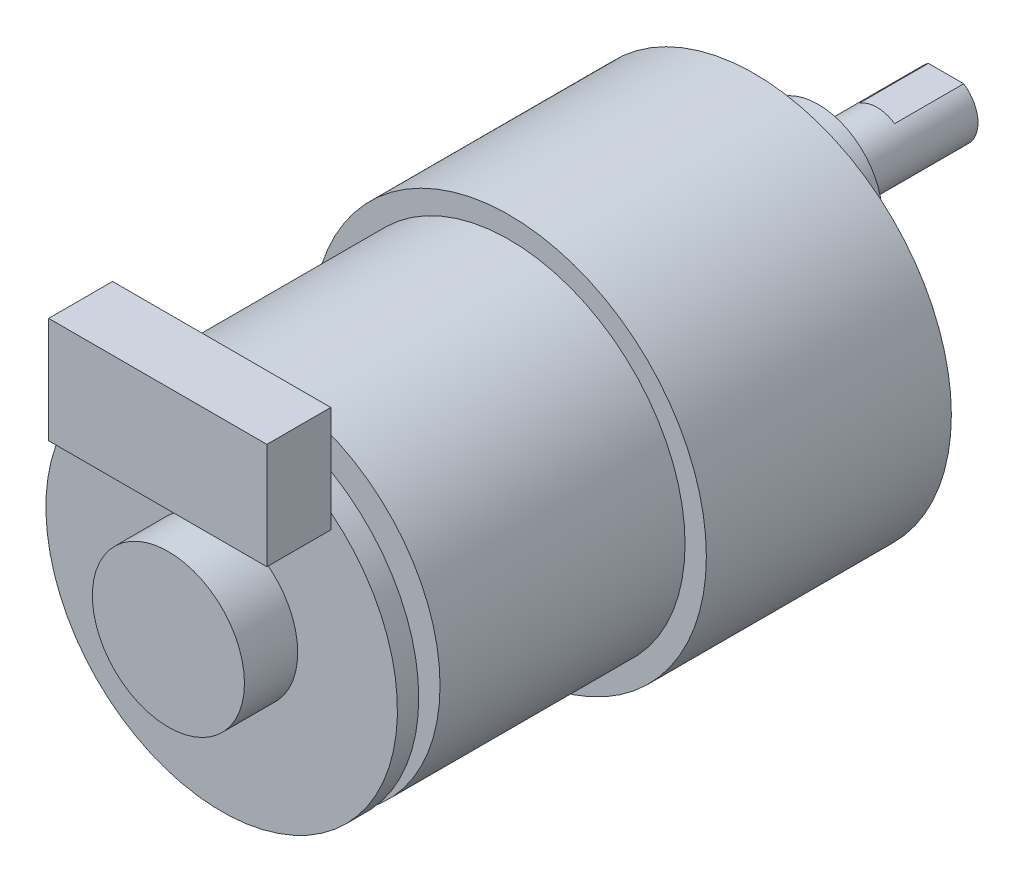
ISO-10303-21;
HEADER;
FILE_DESCRIPTION(('STEP AP214'),'2;1');
FILE_NAME('part.step','',(''),(''),'','','');
FILE_SCHEMA(('AUTOMOTIVE_DESIGN { 1 0 10303 214 1 1 1 1 }'));
ENDSEC;
DATA;
#1=APPLICATION_CONTEXT('core data for automotive mechanical design processes');
#2=APPLICATION_PROTOCOL_DEFINITION('international standard','automotive_design',2000,#1);
#3=PRODUCT_CONTEXT('',#1,'mechanical');
#4=PRODUCT('Part','Part','',(#3));
#5=PRODUCT_RELATED_PRODUCT_CATEGORY('part','',(#4));
#6=PRODUCT_DEFINITION_FORMATION('','',#4);
#7=PRODUCT_DEFINITION_CONTEXT('part definition',#1,'design');
#8=PRODUCT_DEFINITION('design','',#6,#7);
#9=PRODUCT_DEFINITION_SHAPE('','',#8);
#10=(LENGTH_UNIT() NAMED_UNIT(*) SI_UNIT(.MILLI.,.METRE.));
#11=(NAMED_UNIT(*) PLANE_ANGLE_UNIT() SI_UNIT($,.RADIAN.));
#12=(NAMED_UNIT(*) SI_UNIT($,.STERADIAN.) SOLID_ANGLE_UNIT());
#13=UNCERTAINTY_MEASURE_WITH_UNIT(LENGTH_MEASURE(1.E-05),#10,'distance_accuracy_value','');
#14=(GEOMETRIC_REPRESENTATION_CONTEXT(3) GLOBAL_UNCERTAINTY_ASSIGNED_CONTEXT((#13)) GLOBAL_UNIT_ASSIGNED_CONTEXT((#10,
#11,#12)) REPRESENTATION_CONTEXT('',''));
#15=CARTESIAN_POINT('',(0.,0.,0.));
#16=DIRECTION('',(0.,0.,1.));
#17=DIRECTION('',(1.,0.,0.));
#18=AXIS2_PLACEMENT_3D('',#15,#16,#17);
#19=CARTESIAN_POINT('',(0.,0.,50.));
#20=DIRECTION('',(0.,0.,1.));
#21=DIRECTION('',(1.,0.,0.));
#22=AXIS2_PLACEMENT_3D('',#19,#20,#21);
#23=PLANE('',#22);
#24=CARTESIAN_POINT('',(0.,0.,50.));
#25=DIRECTION('',(0.,0.,1.));
#26=DIRECTION('',(1.,0.,0.));
#27=AXIS2_PLACEMENT_3D('',#24,#25,#26);
#28=CIRCLE('',#27,7.13953177742998);
#29=CARTESIAN_POINT('',(7.13953177742998,0.,50.));
#30=VERTEX_POINT('',#29);
#31=EDGE_CURVE('E122',#30,#30,#28,.T.);
#32=ORIENTED_EDGE('',*,*,#31,.F.);
#33=EDGE_LOOP('',(#32));
#34=FACE_BOUND('',#33,.T.);
#35=CARTESIAN_POINT('',(0.,0.,50.));
#36=DIRECTION('',(0.,0.,1.));
#37=DIRECTION('',(1.,0.,0.));
#38=AXIS2_PLACEMENT_3D('',#35,#36,#37);
#39=CIRCLE('',#38,16.5);
#40=CARTESIAN_POINT('',(-10.2436666402565,12.9351186219259,50.));
#41=VERTEX_POINT('',#40);
#42=CARTESIAN_POINT('',(10.2436666402565,12.9351186219259,50.));
#43=VERTEX_POINT('',#42);
#44=EDGE_CURVE('E136',#41,#43,#39,.T.);
#45=ORIENTED_EDGE('',*,*,#44,.T.);
#46=DIRECTION('',(0.,1.,0.));
#47=VECTOR('',#46,1.);
#48=CARTESIAN_POINT('',(10.2436666402565,21.4758750297111,50.));
#49=LINE('',#48,#47);
#50=CARTESIAN_POINT('',(10.2436666402565,11.5241249702889,50.));
#51=VERTEX_POINT('',#50);
#52=EDGE_CURVE('E614',#51,#43,#49,.T.);
#53=ORIENTED_EDGE('',*,*,#52,.F.);
#54=DIRECTION('',(1.,0.,0.));
#55=VECTOR('',#54,1.);
#56=CARTESIAN_POINT('',(-10.2436666402565,11.5241249702889,50.));
#57=LINE('',#56,#55);
#58=CARTESIAN_POINT('',(-10.2436666402565,11.5241249702889,50.));
#59=VERTEX_POINT('',#58);
#60=EDGE_CURVE('E116',#59,#51,#57,.T.);
#61=ORIENTED_EDGE('',*,*,#60,.F.);
#62=DIRECTION('',(0.,1.,0.));
#63=VECTOR('',#62,1.);
#64=CARTESIAN_POINT('',(-10.2436666402565,0.,50.));
#65=LINE('',#64,#63);
#66=EDGE_CURVE('E11',#59,#41,#65,.T.);
#67=ORIENTED_EDGE('',*,*,#66,.T.);
#68=EDGE_LOOP('',(#45,#53,#61,#67));
#69=FACE_BOUND('',#68,.T.);
#70=ADVANCED_FACE('F37',(#34,#69),#23,.T.);
#71=CARTESIAN_POINT('',(0.,0.,23.));
#72=DIRECTION('',(0.,0.,-1.));
#73=DIRECTION('',(-1.,0.,0.));
#74=AXIS2_PLACEMENT_3D('',#71,#72,#73);
#75=CYLINDRICAL_SURFACE('',#74,18.5);
#76=CARTESIAN_POINT('',(0.,0.,23.));
#77=DIRECTION('',(0.,0.,1.));
#78=DIRECTION('',(1.,0.,0.));
#79=AXIS2_PLACEMENT_3D('',#76,#77,#78);
#80=CIRCLE('',#79,18.5);
#81=CARTESIAN_POINT('',(18.5,0.,23.));
#82=VERTEX_POINT('',#81);
#83=EDGE_CURVE('E172',#82,#82,#80,.T.);
#84=ORIENTED_EDGE('',*,*,#83,.F.);
#85=EDGE_LOOP('',(#84));
#86=FACE_BOUND('',#85,.T.);
#87=CARTESIAN_POINT('',(0.,0.,0.));
#88=DIRECTION('',(0.,0.,1.));
#89=DIRECTION('',(1.,0.,0.));
#90=AXIS2_PLACEMENT_3D('',#87,#88,#89);
#91=CIRCLE('',#90,18.5);
#92=CARTESIAN_POINT('',(18.5,0.,0.));
#93=VERTEX_POINT('',#92);
#94=EDGE_CURVE('E169',#93,#93,#91,.T.);
#95=ORIENTED_EDGE('',*,*,#94,.T.);
#96=EDGE_LOOP('',(#95));
#97=FACE_BOUND('',#96,.T.);
#98=ADVANCED_FACE('F39',(#86,#97),#75,.T.);
#99=CARTESIAN_POINT('',(0.,0.,23.));
#100=DIRECTION('',(0.,0.,1.));
#101=DIRECTION('',(1.,0.,0.));
#102=AXIS2_PLACEMENT_3D('',#99,#100,#101);
#103=PLANE('',#102);
#104=CARTESIAN_POINT('',(0.,0.,23.));
#105=DIRECTION('',(0.,0.,1.));
#106=DIRECTION('',(1.,0.,0.));
#107=AXIS2_PLACEMENT_3D('',#104,#105,#106);
#108=CIRCLE('',#107,16.5);
#109=CARTESIAN_POINT('',(16.5,0.,23.));
#110=VERTEX_POINT('',#109);
#111=EDGE_CURVE('E165',#110,#110,#108,.T.);
#112=ORIENTED_EDGE('',*,*,#111,.F.);
#113=EDGE_LOOP('',(#112));
#114=FACE_BOUND('',#113,.T.);
#115=ORIENTED_EDGE('',*,*,#83,.T.);
#116=EDGE_LOOP('',(#115));
#117=FACE_BOUND('',#116,.T.);
#118=ADVANCED_FACE('F207',(#114,#117),#103,.T.);
#119=CARTESIAN_POINT('',(0.,0.,0.));
#120=DIRECTION('',(0.,0.,1.));
#121=DIRECTION('',(1.,0.,0.));
#122=AXIS2_PLACEMENT_3D('',#119,#120,#121);
#123=PLANE('',#122);
#124=CARTESIAN_POINT('',(-7.74999999999997,-13.4233937586588,0.));
#125=DIRECTION('',(0.,0.,-1.));
#126=DIRECTION('',(-1.,0.,0.));
#127=AXIS2_PLACEMENT_3D('',#124,#125,#126);
#128=CIRCLE('',#127,1.5);
#129=CARTESIAN_POINT('',(-9.24999999999997,-13.4233937586588,0.));
#130=VERTEX_POINT('',#129);
#131=EDGE_CURVE('E578',#130,#130,#128,.T.);
#132=ORIENTED_EDGE('',*,*,#131,.F.);
#133=EDGE_LOOP('',(#132));
#134=FACE_BOUND('',#133,.T.);
#135=CARTESIAN_POINT('',(7.75000000000006,-13.4233937586588,0.));
#136=DIRECTION('',(0.,0.,-1.));
#137=DIRECTION('',(-1.,0.,0.));
#138=AXIS2_PLACEMENT_3D('',#135,#136,#137);
#139=CIRCLE('',#138,1.5);
#140=CARTESIAN_POINT('',(6.25000000000006,-13.4233937586588,0.));
#141=VERTEX_POINT('',#140);
#142=EDGE_CURVE('E582',#141,#141,#139,.T.);
#143=ORIENTED_EDGE('',*,*,#142,.F.);
#144=EDGE_LOOP('',(#143));
#145=FACE_BOUND('',#144,.T.);
#146=CARTESIAN_POINT('',(15.5,1.08235921504137E-13,0.));
#147=DIRECTION('',(0.,0.,-1.));
#148=DIRECTION('',(-1.,0.,0.));
#149=AXIS2_PLACEMENT_3D('',#146,#147,#148);
#150=CIRCLE('',#149,1.5);
#151=CARTESIAN_POINT('',(14.,1.08235921504137E-13,0.));
#152=VERTEX_POINT('',#151);
#153=EDGE_CURVE('E586',#152,#152,#150,.T.);
#154=ORIENTED_EDGE('',*,*,#153,.F.);
#155=EDGE_LOOP('',(#154));
#156=FACE_BOUND('',#155,.T.);
#157=CARTESIAN_POINT('',(7.74999999999987,13.4233937586589,0.));
#158=DIRECTION('',(0.,0.,-1.));
#159=DIRECTION('',(-1.,0.,0.));
#160=AXIS2_PLACEMENT_3D('',#157,#158,#159);
#161=CIRCLE('',#160,1.5);
#162=CARTESIAN_POINT('',(6.24999999999987,13.4233937586589,0.));
#163=VERTEX_POINT('',#162);
#164=EDGE_CURVE('E590',#163,#163,#161,.T.);
#165=ORIENTED_EDGE('',*,*,#164,.F.);
#166=EDGE_LOOP('',(#165));
#167=FACE_BOUND('',#166,.T.);
#168=CARTESIAN_POINT('',(-7.75000000000016,13.4233937586587,0.));
#169=DIRECTION('',(0.,0.,-1.));
#170=DIRECTION('',(-1.,0.,0.));
#171=AXIS2_PLACEMENT_3D('',#168,#169,#170);
#172=CIRCLE('',#171,1.5);
#173=CARTESIAN_POINT('',(-9.25000000000016,13.4233937586587,0.));
#174=VERTEX_POINT('',#173);
#175=EDGE_CURVE('E594',#174,#174,#172,.T.);
#176=ORIENTED_EDGE('',*,*,#175,.F.);
#177=EDGE_LOOP('',(#176));
#178=FACE_BOUND('',#177,.T.);
#179=CARTESIAN_POINT('',(-15.5,0.,0.));
#180=DIRECTION('',(0.,0.,-1.));
#181=DIRECTION('',(-1.,0.,0.));
#182=AXIS2_PLACEMENT_3D('',#179,#180,#181);
#183=CIRCLE('',#182,1.5);
#184=CARTESIAN_POINT('',(-17.,0.,0.));
#185=VERTEX_POINT('',#184);
#186=EDGE_CURVE('E598',#185,#185,#183,.T.);
#187=ORIENTED_EDGE('',*,*,#186,.F.);
#188=EDGE_LOOP('',(#187));
#189=FACE_BOUND('',#188,.T.);
#190=CARTESIAN_POINT('',(0.,7.,0.));
#191=DIRECTION('',(0.,0.,1.));
#192=DIRECTION('',(1.,0.,0.));
#193=AXIS2_PLACEMENT_3D('',#190,#191,#192);
#194=CIRCLE('',#193,6.);
#195=CARTESIAN_POINT('',(6.,7.,0.));
#196=VERTEX_POINT('',#195);
#197=EDGE_CURVE('E175',#196,#196,#194,.F.);
#198=ORIENTED_EDGE('',*,*,#197,.F.);
#199=EDGE_LOOP('',(#198));
#200=FACE_BOUND('',#199,.T.);
#201=ORIENTED_EDGE('',*,*,#94,.F.);
#202=EDGE_LOOP('',(#201));
#203=FACE_BOUND('',#202,.T.);
#204=ADVANCED_FACE('F528',(#134,#145,#156,#167,#178,#189,#200,#203),#123,.F.);
#205=CARTESIAN_POINT('',(0.,0.,46.));
#206=DIRECTION('',(0.,0.,-1.));
#207=DIRECTION('',(-1.,0.,0.));
#208=AXIS2_PLACEMENT_3D('',#205,#206,#207);
#209=CYLINDRICAL_SURFACE('',#208,16.5);
#210=CARTESIAN_POINT('',(0.,0.,46.));
#211=DIRECTION('',(0.,0.,1.));
#212=DIRECTION('',(1.,0.,0.));
#213=AXIS2_PLACEMENT_3D('',#210,#211,#212);
#214=CIRCLE('',#213,16.5);
#215=CARTESIAN_POINT('',(16.5,0.,46.));
#216=VERTEX_POINT('',#215);
#217=EDGE_CURVE('E166',#216,#216,#214,.T.);
#218=ORIENTED_EDGE('',*,*,#217,.F.);
#219=EDGE_LOOP('',(#218));
#220=FACE_BOUND('',#219,.T.);
#221=ORIENTED_EDGE('',*,*,#111,.T.);
#222=EDGE_LOOP('',(#221));
#223=FACE_BOUND('',#222,.T.);
#224=ADVANCED_FACE('F520',(#220,#223),#209,.T.);
#225=CARTESIAN_POINT('',(0.,0.,46.));
#226=DIRECTION('',(0.,0.,1.));
#227=DIRECTION('',(1.,0.,0.));
#228=AXIS2_PLACEMENT_3D('',#225,#226,#227);
#229=PLANE('',#228);
#230=CARTESIAN_POINT('',(10.,0.,46.));
#231=DIRECTION('',(0.,0.,1.));
#232=DIRECTION('',(1.,0.,0.));
#233=AXIS2_PLACEMENT_3D('',#230,#231,#232);
#234=CIRCLE('',#233,1.);
#235=CARTESIAN_POINT('',(11.,0.,46.));
#236=VERTEX_POINT('',#235);
#237=EDGE_CURVE('E135',#236,#236,#234,.T.);
#238=ORIENTED_EDGE('',*,*,#237,.F.);
#239=EDGE_LOOP('',(#238));
#240=FACE_BOUND('',#239,.T.);
#241=CARTESIAN_POINT('',(-10.,0.,46.));
#242=DIRECTION('',(0.,0.,1.));
#243=DIRECTION('',(1.,0.,0.));
#244=AXIS2_PLACEMENT_3D('',#241,#242,#243);
#245=CIRCLE('',#244,1.);
#246=CARTESIAN_POINT('',(-9.,0.,46.));
#247=VERTEX_POINT('',#246);
#248=EDGE_CURVE('E142',#247,#247,#245,.T.);
#249=ORIENTED_EDGE('',*,*,#248,.F.);
#250=EDGE_LOOP('',(#249));
#251=FACE_BOUND('',#250,.T.);
#252=ORIENTED_EDGE('',*,*,#217,.T.);
#253=EDGE_LOOP('',(#252));
#254=FACE_BOUND('',#253,.T.);
#255=ADVANCED_FACE('F510',(#240,#251,#254),#229,.T.);
#256=CARTESIAN_POINT('',(0.,7.,-6.));
#257=DIRECTION('',(0.,0.,1.));
#258=DIRECTION('',(1.,0.,0.));
#259=AXIS2_PLACEMENT_3D('',#256,#257,#258);
#260=CYLINDRICAL_SURFACE('',#259,6.);
#261=CARTESIAN_POINT('',(0.,7.,-6.));
#262=DIRECTION('',(0.,0.,-1.));
#263=DIRECTION('',(-1.,0.,0.));
#264=AXIS2_PLACEMENT_3D('',#261,#262,#263);
#265=CIRCLE('',#264,6.);
#266=CARTESIAN_POINT('',(-6.,7.,-6.));
#267=VERTEX_POINT('',#266);
#268=EDGE_CURVE('E160',#267,#267,#265,.T.);
#269=ORIENTED_EDGE('',*,*,#268,.F.);
#270=EDGE_LOOP('',(#269));
#271=FACE_BOUND('',#270,.T.);
#272=ORIENTED_EDGE('',*,*,#197,.T.);
#273=EDGE_LOOP('',(#272));
#274=FACE_BOUND('',#273,.T.);
#275=ADVANCED_FACE('F500',(#271,#274),#260,.T.);
#276=CARTESIAN_POINT('',(0.,7.,-6.));
#277=DIRECTION('',(0.,0.,-1.));
#278=DIRECTION('',(-1.,0.,0.));
#279=AXIS2_PLACEMENT_3D('',#276,#277,#278);
#280=PLANE('',#279);
#281=CARTESIAN_POINT('',(0.,7.,-6.));
#282=DIRECTION('',(0.,0.,-1.));
#283=DIRECTION('',(-1.,0.,0.));
#284=AXIS2_PLACEMENT_3D('',#281,#282,#283);
#285=CIRCLE('',#284,3.);
#286=CARTESIAN_POINT('',(-3.,7.,-6.));
#287=VERTEX_POINT('',#286);
#288=EDGE_CURVE('E156',#287,#287,#285,.T.);
#289=ORIENTED_EDGE('',*,*,#288,.F.);
#290=EDGE_LOOP('',(#289));
#291=FACE_BOUND('',#290,.T.);
#292=ORIENTED_EDGE('',*,*,#268,.T.);
#293=EDGE_LOOP('',(#292));
#294=FACE_BOUND('',#293,.T.);
#295=ADVANCED_FACE('F199',(#291,#294),#280,.T.);
#296=CARTESIAN_POINT('',(0.,7.,-18.));
#297=DIRECTION('',(0.,0.,1.));
#298=DIRECTION('',(1.,0.,0.));
#299=AXIS2_PLACEMENT_3D('',#296,#297,#298);
#300=CYLINDRICAL_SURFACE('',#299,3.);
#301=CARTESIAN_POINT('',(0.,7.,-18.));
#302=DIRECTION('',(0.,0.,-1.));
#303=DIRECTION('',(-1.,0.,0.));
#304=AXIS2_PLACEMENT_3D('',#301,#302,#303);
#305=CIRCLE('',#304,3.);
#306=CARTESIAN_POINT('',(1.6583123951777,9.5,-18.));
#307=VERTEX_POINT('',#306);
#308=CARTESIAN_POINT('',(-1.6583123951777,9.5,-18.));
#309=VERTEX_POINT('',#308);
#310=EDGE_CURVE('E157',#307,#309,#305,.T.);
#311=ORIENTED_EDGE('',*,*,#310,.F.);
#312=DIRECTION('',(0.,0.,1.));
#313=VECTOR('',#312,1.);
#314=CARTESIAN_POINT('',(1.6583123951777,9.5,-18.));
#315=LINE('',#314,#313);
#316=CARTESIAN_POINT('',(1.6583123951777,9.5,-11.514541776509));
#317=VERTEX_POINT('',#316);
#318=EDGE_CURVE('E60',#307,#317,#315,.T.);
#319=ORIENTED_EDGE('',*,*,#318,.T.);
#320=CARTESIAN_POINT('',(0.,7.,-11.514541776509));
#321=DIRECTION('',(0.,0.,1.));
#322=DIRECTION('',(0.,-1.,0.));
#323=AXIS2_PLACEMENT_3D('',#320,#321,#322);
#324=CIRCLE('',#323,3.);
#325=CARTESIAN_POINT('',(-1.6583123951777,9.5,-11.514541776509));
#326=VERTEX_POINT('',#325);
#327=EDGE_CURVE('E45',#317,#326,#324,.T.);
#328=ORIENTED_EDGE('',*,*,#327,.T.);
#329=DIRECTION('',(0.,0.,1.));
#330=VECTOR('',#329,1.);
#331=CARTESIAN_POINT('',(-1.6583123951777,9.5,-18.));
#332=LINE('',#331,#330);
#333=EDGE_CURVE('E152',#326,#309,#332,.F.);
#334=ORIENTED_EDGE('',*,*,#333,.T.);
#335=EDGE_LOOP('',(#311,#319,#328,#334));
#336=FACE_BOUND('',#335,.T.);
#337=ORIENTED_EDGE('',*,*,#288,.T.);
#338=EDGE_LOOP('',(#337));
#339=FACE_BOUND('',#338,.T.);
#340=ADVANCED_FACE('F184',(#336,#339),#300,.T.);
#341=CARTESIAN_POINT('',(0.,7.,-18.));
#342=DIRECTION('',(0.,0.,-1.));
#343=DIRECTION('',(-1.,0.,0.));
#344=AXIS2_PLACEMENT_3D('',#341,#342,#343);
#345=PLANE('',#344);
#346=DIRECTION('',(-1.,0.,0.));
#347=VECTOR('',#346,1.);
#348=CARTESIAN_POINT('',(0.,9.5,-18.));
#349=LINE('',#348,#347);
#350=EDGE_CURVE('E180',#307,#309,#349,.T.);
#351=ORIENTED_EDGE('',*,*,#350,.F.);
#352=ORIENTED_EDGE('',*,*,#310,.T.);
#353=EDGE_LOOP('',(#351,#352));
#354=FACE_BOUND('',#353,.T.);
#355=ADVANCED_FACE('F191',(#354),#345,.T.);
#356=CARTESIAN_POINT('',(-18.5,19.93869594,-11.514541776509));
#357=DIRECTION('',(0.,0.,1.));
#358=DIRECTION('',(0.,-1.,0.));
#359=AXIS2_PLACEMENT_3D('',#356,#357,#358);
#360=PLANE('',#359);
#361=DIRECTION('',(1.,0.,0.));
#362=VECTOR('',#361,1.);
#363=CARTESIAN_POINT('',(-18.5,9.5,-11.514541776509));
#364=LINE('',#363,#362);
#365=EDGE_CURVE('E148',#326,#317,#364,.T.);
#366=ORIENTED_EDGE('',*,*,#365,.F.);
#367=ORIENTED_EDGE('',*,*,#327,.F.);
#368=EDGE_LOOP('',(#366,#367));
#369=FACE_BOUND('',#368,.T.);
#370=ADVANCED_FACE('F188',(#369),#360,.F.);
#371=CARTESIAN_POINT('',(-18.5,9.5,-11.514541776509));
#372=DIRECTION('',(0.,-1.,0.));
#373=DIRECTION('',(0.,0.,-1.));
#374=AXIS2_PLACEMENT_3D('',#371,#372,#373);
#375=PLANE('',#374);
#376=ORIENTED_EDGE('',*,*,#350,.T.);
#377=ORIENTED_EDGE('',*,*,#333,.F.);
#378=ORIENTED_EDGE('',*,*,#365,.T.);
#379=ORIENTED_EDGE('',*,*,#318,.F.);
#380=EDGE_LOOP('',(#376,#377,#378,#379));
#381=FACE_BOUND('',#380,.T.);
#382=ADVANCED_FACE('F189',(#381),#375,.F.);
#383=CARTESIAN_POINT('',(-10.,0.,48.));
#384=DIRECTION('',(0.,0.,-1.));
#385=DIRECTION('',(-1.,0.,0.));
#386=AXIS2_PLACEMENT_3D('',#383,#384,#385);
#387=CYLINDRICAL_SURFACE('',#386,1.);
#388=CARTESIAN_POINT('',(-10.,0.,48.));
#389=DIRECTION('',(0.,0.,1.));
#390=DIRECTION('',(1.,0.,0.));
#391=AXIS2_PLACEMENT_3D('',#388,#389,#390);
#392=CIRCLE('',#391,1.);
#393=CARTESIAN_POINT('',(-9.,0.,48.));
#394=VERTEX_POINT('',#393);
#395=EDGE_CURVE('E145',#394,#394,#392,.T.);
#396=ORIENTED_EDGE('',*,*,#395,.F.);
#397=EDGE_LOOP('',(#396));
#398=FACE_BOUND('',#397,.T.);
#399=ORIENTED_EDGE('',*,*,#248,.T.);
#400=EDGE_LOOP('',(#399));
#401=FACE_BOUND('',#400,.T.);
#402=ADVANCED_FACE('F226',(#398,#401),#387,.T.);
#403=CARTESIAN_POINT('',(10.,0.,48.));
#404=DIRECTION('',(0.,0.,-1.));
#405=DIRECTION('',(-1.,0.,0.));
#406=AXIS2_PLACEMENT_3D('',#403,#404,#405);
#407=CYLINDRICAL_SURFACE('',#406,1.);
#408=CARTESIAN_POINT('',(10.,0.,48.));
#409=DIRECTION('',(0.,0.,1.));
#410=DIRECTION('',(1.,0.,0.));
#411=AXIS2_PLACEMENT_3D('',#408,#409,#410);
#412=CIRCLE('',#411,1.);
#413=CARTESIAN_POINT('',(11.,0.,48.));
#414=VERTEX_POINT('',#413);
#415=EDGE_CURVE('E139',#414,#414,#412,.T.);
#416=ORIENTED_EDGE('',*,*,#415,.F.);
#417=EDGE_LOOP('',(#416));
#418=FACE_BOUND('',#417,.T.);
#419=ORIENTED_EDGE('',*,*,#237,.T.);
#420=EDGE_LOOP('',(#419));
#421=FACE_BOUND('',#420,.T.);
#422=ADVANCED_FACE('F222',(#418,#421),#407,.T.);
#423=CARTESIAN_POINT('',(0.,0.,50.));
#424=DIRECTION('',(0.,0.,-1.));
#425=DIRECTION('',(-1.,0.,0.));
#426=AXIS2_PLACEMENT_3D('',#423,#424,#425);
#427=CYLINDRICAL_SURFACE('',#426,16.5);
#428=EDGE_CURVE('E133',#43,#41,#39,.T.);
#429=ORIENTED_EDGE('',*,*,#428,.F.);
#430=ORIENTED_EDGE('',*,*,#44,.F.);
#431=EDGE_LOOP('',(#429,#430));
#432=FACE_BOUND('',#431,.T.);
#433=CARTESIAN_POINT('',(0.,0.,48.));
#434=DIRECTION('',(0.,0.,1.));
#435=DIRECTION('',(1.,0.,0.));
#436=AXIS2_PLACEMENT_3D('',#433,#434,#435);
#437=CIRCLE('',#436,16.5);
#438=CARTESIAN_POINT('',(16.5,0.,48.));
#439=VERTEX_POINT('',#438);
#440=EDGE_CURVE('E131',#439,#439,#437,.T.);
#441=ORIENTED_EDGE('',*,*,#440,.T.);
#442=EDGE_LOOP('',(#441));
#443=FACE_BOUND('',#442,.T.);
#444=ADVANCED_FACE('F218',(#432,#443),#427,.T.);
#445=CARTESIAN_POINT('',(0.,0.,48.));
#446=DIRECTION('',(0.,0.,1.));
#447=DIRECTION('',(1.,0.,0.));
#448=AXIS2_PLACEMENT_3D('',#445,#446,#447);
#449=PLANE('',#448);
#450=ORIENTED_EDGE('',*,*,#395,.T.);
#451=EDGE_LOOP('',(#450));
#452=FACE_BOUND('',#451,.T.);
#453=ORIENTED_EDGE('',*,*,#415,.T.);
#454=EDGE_LOOP('',(#453));
#455=FACE_BOUND('',#454,.T.);
#456=ORIENTED_EDGE('',*,*,#440,.F.);
#457=EDGE_LOOP('',(#456));
#458=FACE_BOUND('',#457,.T.);
#459=ADVANCED_FACE('F215',(#452,#455,#458),#449,.F.);
#460=CARTESIAN_POINT('',(0.,0.,55.));
#461=DIRECTION('',(0.,0.,-1.));
#462=DIRECTION('',(-1.,0.,0.));
#463=AXIS2_PLACEMENT_3D('',#460,#461,#462);
#464=CYLINDRICAL_SURFACE('',#463,7.13953177742998);
#465=CARTESIAN_POINT('',(0.,0.,55.));
#466=DIRECTION('',(0.,0.,1.));
#467=DIRECTION('',(1.,0.,0.));
#468=AXIS2_PLACEMENT_3D('',#465,#466,#467);
#469=CIRCLE('',#468,7.13953177742998);
#470=CARTESIAN_POINT('',(7.13953177742998,0.,55.));
#471=VERTEX_POINT('',#470);
#472=EDGE_CURVE('E125',#471,#471,#469,.T.);
#473=ORIENTED_EDGE('',*,*,#472,.F.);
#474=EDGE_LOOP('',(#473));
#475=FACE_BOUND('',#474,.T.);
#476=ORIENTED_EDGE('',*,*,#31,.T.);
#477=EDGE_LOOP('',(#476));
#478=FACE_BOUND('',#477,.T.);
#479=ADVANCED_FACE('F213',(#475,#478),#464,.T.);
#480=CARTESIAN_POINT('',(0.,0.,55.));
#481=DIRECTION('',(0.,0.,1.));
#482=DIRECTION('',(1.,0.,0.));
#483=AXIS2_PLACEMENT_3D('',#480,#481,#482);
#484=PLANE('',#483);
#485=ORIENTED_EDGE('',*,*,#472,.T.);
#486=EDGE_LOOP('',(#485));
#487=FACE_BOUND('',#486,.T.);
#488=ADVANCED_FACE('F259',(#487),#484,.T.);
#489=CARTESIAN_POINT('',(10.2436666402565,21.4758750297111,56.));
#490=DIRECTION('',(-1.,0.,0.));
#491=DIRECTION('',(0.,0.,1.));
#492=AXIS2_PLACEMENT_3D('',#489,#490,#491);
#493=PLANE('',#492);
#494=ORIENTED_EDGE('',*,*,#52,.T.);
#495=CARTESIAN_POINT('',(10.2436666402565,21.4758750297111,50.));
#496=VERTEX_POINT('',#495);
#497=EDGE_CURVE('E120',#43,#496,#49,.T.);
#498=ORIENTED_EDGE('',*,*,#497,.T.);
#499=DIRECTION('',(0.,0.,-1.));
#500=VECTOR('',#499,1.);
#501=CARTESIAN_POINT('',(10.2436666402565,21.4758750297111,56.));
#502=LINE('',#501,#500);
#503=CARTESIAN_POINT('',(10.2436666402565,21.4758750297111,56.));
#504=VERTEX_POINT('',#503);
#505=EDGE_CURVE('E102',#504,#496,#502,.T.);
#506=ORIENTED_EDGE('',*,*,#505,.F.);
#507=DIRECTION('',(0.,1.,0.));
#508=VECTOR('',#507,1.);
#509=CARTESIAN_POINT('',(10.2436666402565,21.4758750297111,56.));
#510=LINE('',#509,#508);
#511=CARTESIAN_POINT('',(10.2436666402565,11.5241249702889,56.));
#512=VERTEX_POINT('',#511);
#513=EDGE_CURVE('E108',#512,#504,#510,.T.);
#514=ORIENTED_EDGE('',*,*,#513,.F.);
#515=DIRECTION('',(0.,0.,-1.));
#516=VECTOR('',#515,1.);
#517=CARTESIAN_POINT('',(10.2436666402565,11.5241249702889,56.));
#518=LINE('',#517,#516);
#519=EDGE_CURVE('E613',#512,#51,#518,.T.);
#520=ORIENTED_EDGE('',*,*,#519,.T.);
#521=EDGE_LOOP('',(#494,#498,#506,#514,#520));
#522=FACE_BOUND('',#521,.T.);
#523=ADVANCED_FACE('F119',(#522),#493,.F.);
#524=CARTESIAN_POINT('',(-10.2436666402565,21.4758750297111,56.));
#525=DIRECTION('',(0.,-1.,0.));
#526=DIRECTION('',(0.,0.,-1.));
#527=AXIS2_PLACEMENT_3D('',#524,#525,#526);
#528=PLANE('',#527);
#529=DIRECTION('',(-1.,0.,0.));
#530=VECTOR('',#529,1.);
#531=CARTESIAN_POINT('',(-10.2436666402565,21.4758750297111,50.));
#532=LINE('',#531,#530);
#533=CARTESIAN_POINT('',(-10.2436666402565,21.4758750297111,50.));
#534=VERTEX_POINT('',#533);
#535=EDGE_CURVE('E616',#496,#534,#532,.T.);
#536=ORIENTED_EDGE('',*,*,#535,.T.);
#537=DIRECTION('',(0.,0.,-1.));
#538=VECTOR('',#537,1.);
#539=CARTESIAN_POINT('',(-10.2436666402565,21.4758750297111,56.));
#540=LINE('',#539,#538);
#541=CARTESIAN_POINT('',(-10.2436666402565,21.4758750297111,56.));
#542=VERTEX_POINT('',#541);
#543=EDGE_CURVE('E104',#542,#534,#540,.T.);
#544=ORIENTED_EDGE('',*,*,#543,.F.);
#545=DIRECTION('',(-1.,0.,0.));
#546=VECTOR('',#545,1.);
#547=CARTESIAN_POINT('',(-10.2436666402565,21.4758750297111,56.));
#548=LINE('',#547,#546);
#549=EDGE_CURVE('E98',#504,#542,#548,.T.);
#550=ORIENTED_EDGE('',*,*,#549,.F.);
#551=ORIENTED_EDGE('',*,*,#505,.T.);
#552=EDGE_LOOP('',(#536,#544,#550,#551));
#553=FACE_BOUND('',#552,.T.);
#554=ADVANCED_FACE('F100',(#553),#528,.F.);
#555=CARTESIAN_POINT('',(-10.2436666402565,21.4758750297111,56.));
#556=DIRECTION('',(1.,0.,0.));
#557=DIRECTION('',(0.,0.,-1.));
#558=AXIS2_PLACEMENT_3D('',#555,#556,#557);
#559=PLANE('',#558);
#560=DIRECTION('',(0.,-1.,0.));
#561=VECTOR('',#560,1.);
#562=CARTESIAN_POINT('',(-10.2436666402565,21.4758750297111,50.));
#563=LINE('',#562,#561);
#564=EDGE_CURVE('E618',#534,#41,#563,.T.);
#565=ORIENTED_EDGE('',*,*,#564,.T.);
#566=ORIENTED_EDGE('',*,*,#66,.F.);
#567=DIRECTION('',(0.,0.,-1.));
#568=VECTOR('',#567,1.);
#569=CARTESIAN_POINT('',(-10.2436666402565,11.5241249702889,56.));
#570=LINE('',#569,#568);
#571=CARTESIAN_POINT('',(-10.2436666402565,11.5241249702889,56.));
#572=VERTEX_POINT('',#571);
#573=EDGE_CURVE('E52',#572,#59,#570,.T.);
#574=ORIENTED_EDGE('',*,*,#573,.F.);
#575=DIRECTION('',(0.,-1.,0.));
#576=VECTOR('',#575,1.);
#577=CARTESIAN_POINT('',(-10.2436666402565,21.4758750297111,56.));
#578=LINE('',#577,#576);
#579=EDGE_CURVE('E107',#542,#572,#578,.T.);
#580=ORIENTED_EDGE('',*,*,#579,.F.);
#581=ORIENTED_EDGE('',*,*,#543,.T.);
#582=EDGE_LOOP('',(#565,#566,#574,#580,#581));
#583=FACE_BOUND('',#582,.T.);
#584=ADVANCED_FACE('F281',(#583),#559,.F.);
#585=CARTESIAN_POINT('',(-10.2436666402565,11.5241249702889,56.));
#586=DIRECTION('',(0.,1.,0.));
#587=DIRECTION('',(0.,0.,1.));
#588=AXIS2_PLACEMENT_3D('',#585,#586,#587);
#589=PLANE('',#588);
#590=ORIENTED_EDGE('',*,*,#60,.T.);
#591=ORIENTED_EDGE('',*,*,#519,.F.);
#592=DIRECTION('',(1.,0.,0.));
#593=VECTOR('',#592,1.);
#594=CARTESIAN_POINT('',(-10.2436666402565,11.5241249702889,56.));
#595=LINE('',#594,#593);
#596=EDGE_CURVE('E112',#572,#512,#595,.T.);
#597=ORIENTED_EDGE('',*,*,#596,.F.);
#598=ORIENTED_EDGE('',*,*,#573,.T.);
#599=EDGE_LOOP('',(#590,#591,#597,#598));
#600=FACE_BOUND('',#599,.T.);
#601=ADVANCED_FACE('F289',(#600),#589,.F.);
#602=CARTESIAN_POINT('',(0.,0.,56.));
#603=DIRECTION('',(0.,0.,1.));
#604=DIRECTION('',(1.,0.,0.));
#605=AXIS2_PLACEMENT_3D('',#602,#603,#604);
#606=PLANE('',#605);
#607=ORIENTED_EDGE('',*,*,#513,.T.);
#608=ORIENTED_EDGE('',*,*,#549,.T.);
#609=ORIENTED_EDGE('',*,*,#579,.T.);
#610=ORIENTED_EDGE('',*,*,#596,.T.);
#611=EDGE_LOOP('',(#607,#608,#609,#610));
#612=FACE_BOUND('',#611,.T.);
#613=ADVANCED_FACE('F111',(#612),#606,.T.);
#614=CARTESIAN_POINT('',(0.,0.,50.));
#615=DIRECTION('',(0.,0.,1.));
#616=DIRECTION('',(1.,0.,0.));
#617=AXIS2_PLACEMENT_3D('',#614,#615,#616);
#618=PLANE('',#617);
#619=ORIENTED_EDGE('',*,*,#497,.F.);
#620=ORIENTED_EDGE('',*,*,#428,.T.);
#621=ORIENTED_EDGE('',*,*,#564,.F.);
#622=ORIENTED_EDGE('',*,*,#535,.F.);
#623=EDGE_LOOP('',(#619,#620,#621,#622));
#624=FACE_BOUND('',#623,.T.);
#625=ADVANCED_FACE('F302',(#624),#618,.F.);
#626=CARTESIAN_POINT('',(-15.5,0.,2.));
#627=DIRECTION('',(0.,0.,-1.));
#628=DIRECTION('',(-1.,0.,0.));
#629=AXIS2_PLACEMENT_3D('',#626,#627,#628);
#630=CYLINDRICAL_SURFACE('',#629,1.5);
#631=CARTESIAN_POINT('',(-15.5,0.,2.));
#632=DIRECTION('',(0.,0.,-1.));
#633=DIRECTION('',(-1.,0.,0.));
#634=AXIS2_PLACEMENT_3D('',#631,#632,#633);
#635=CIRCLE('',#634,1.5);
#636=CARTESIAN_POINT('',(-17.,0.,2.));
#637=VERTEX_POINT('',#636);
#638=EDGE_CURVE('E602',#637,#637,#635,.T.);
#639=ORIENTED_EDGE('',*,*,#638,.F.);
#640=EDGE_LOOP('',(#639));
#641=FACE_BOUND('',#640,.T.);
#642=ORIENTED_EDGE('',*,*,#186,.T.);
#643=EDGE_LOOP('',(#642));
#644=FACE_BOUND('',#643,.T.);
#645=ADVANCED_FACE('F308',(#641,#644),#630,.F.);
#646=CARTESIAN_POINT('',(-15.5,0.,2.));
#647=DIRECTION('',(0.,0.,-1.));
#648=DIRECTION('',(-1.,0.,0.));
#649=AXIS2_PLACEMENT_3D('',#646,#647,#648);
#650=PLANE('',#649);
#651=ORIENTED_EDGE('',*,*,#638,.T.);
#652=EDGE_LOOP('',(#651));
#653=FACE_BOUND('',#652,.T.);
#654=ADVANCED_FACE('F317',(#653),#650,.T.);
#655=CARTESIAN_POINT('',(-7.75000000000016,13.4233937586587,2.));
#656=DIRECTION('',(0.,0.,-1.));
#657=DIRECTION('',(-1.,0.,0.));
#658=AXIS2_PLACEMENT_3D('',#655,#656,#657);
#659=CYLINDRICAL_SURFACE('',#658,1.5);
#660=CARTESIAN_POINT('',(-7.75000000000016,13.4233937586587,2.));
#661=DIRECTION('',(0.,0.,-1.));
#662=DIRECTION('',(-1.,0.,0.));
#663=AXIS2_PLACEMENT_3D('',#660,#661,#662);
#664=CIRCLE('',#663,1.5);
#665=CARTESIAN_POINT('',(-9.25000000000016,13.4233937586587,2.));
#666=VERTEX_POINT('',#665);
#667=EDGE_CURVE('E632',#666,#666,#664,.T.);
#668=ORIENTED_EDGE('',*,*,#667,.F.);
#669=EDGE_LOOP('',(#668));
#670=FACE_BOUND('',#669,.T.);
#671=ORIENTED_EDGE('',*,*,#175,.T.);
#672=EDGE_LOOP('',(#671));
#673=FACE_BOUND('',#672,.T.);
#674=ADVANCED_FACE('F326',(#670,#673),#659,.F.);
#675=CARTESIAN_POINT('',(-7.75000000000016,13.4233937586587,2.));
#676=DIRECTION('',(0.,0.,-1.));
#677=DIRECTION('',(-1.,0.,0.));
#678=AXIS2_PLACEMENT_3D('',#675,#676,#677);
#679=PLANE('',#678);
#680=ORIENTED_EDGE('',*,*,#667,.T.);
#681=EDGE_LOOP('',(#680));
#682=FACE_BOUND('',#681,.T.);
#683=ADVANCED_FACE('F334',(#682),#679,.T.);
#684=CARTESIAN_POINT('',(7.74999999999987,13.4233937586589,2.));
#685=DIRECTION('',(0.,0.,-1.));
#686=DIRECTION('',(-1.,0.,0.));
#687=AXIS2_PLACEMENT_3D('',#684,#685,#686);
#688=CYLINDRICAL_SURFACE('',#687,1.5);
#689=CARTESIAN_POINT('',(7.74999999999987,13.4233937586589,2.));
#690=DIRECTION('',(0.,0.,-1.));
#691=DIRECTION('',(-1.,0.,0.));
#692=AXIS2_PLACEMENT_3D('',#689,#690,#691);
#693=CIRCLE('',#692,1.5);
#694=CARTESIAN_POINT('',(6.24999999999987,13.4233937586589,2.));
#695=VERTEX_POINT('',#694);
#696=EDGE_CURVE('E636',#695,#695,#693,.T.);
#697=ORIENTED_EDGE('',*,*,#696,.F.);
#698=EDGE_LOOP('',(#697));
#699=FACE_BOUND('',#698,.T.);
#700=ORIENTED_EDGE('',*,*,#164,.T.);
#701=EDGE_LOOP('',(#700));
#702=FACE_BOUND('',#701,.T.);
#703=ADVANCED_FACE('F342',(#699,#702),#688,.F.);
#704=CARTESIAN_POINT('',(7.74999999999987,13.4233937586589,2.));
#705=DIRECTION('',(0.,0.,-1.));
#706=DIRECTION('',(-1.,0.,0.));
#707=AXIS2_PLACEMENT_3D('',#704,#705,#706);
#708=PLANE('',#707);
#709=ORIENTED_EDGE('',*,*,#696,.T.);
#710=EDGE_LOOP('',(#709));
#711=FACE_BOUND('',#710,.T.);
#712=ADVANCED_FACE('F350',(#711),#708,.T.);
#713=CARTESIAN_POINT('',(15.5,1.08235921504137E-13,2.));
#714=DIRECTION('',(0.,0.,-1.));
#715=DIRECTION('',(-1.,0.,0.));
#716=AXIS2_PLACEMENT_3D('',#713,#714,#715);
#717=CYLINDRICAL_SURFACE('',#716,1.5);
#718=CARTESIAN_POINT('',(15.5,1.08235921504137E-13,2.));
#719=DIRECTION('',(0.,0.,-1.));
#720=DIRECTION('',(-1.,0.,0.));
#721=AXIS2_PLACEMENT_3D('',#718,#719,#720);
#722=CIRCLE('',#721,1.5);
#723=CARTESIAN_POINT('',(14.,1.08235921504137E-13,2.));
#724=VERTEX_POINT('',#723);
#725=EDGE_CURVE('E640',#724,#724,#722,.T.);
#726=ORIENTED_EDGE('',*,*,#725,.F.);
#727=EDGE_LOOP('',(#726));
#728=FACE_BOUND('',#727,.T.);
#729=ORIENTED_EDGE('',*,*,#153,.T.);
#730=EDGE_LOOP('',(#729));
#731=FACE_BOUND('',#730,.T.);
#732=ADVANCED_FACE('F358',(#728,#731),#717,.F.);
#733=CARTESIAN_POINT('',(15.5,1.08235921504137E-13,2.));
#734=DIRECTION('',(0.,0.,-1.));
#735=DIRECTION('',(-1.,0.,0.));
#736=AXIS2_PLACEMENT_3D('',#733,#734,#735);
#737=PLANE('',#736);
#738=ORIENTED_EDGE('',*,*,#725,.T.);
#739=EDGE_LOOP('',(#738));
#740=FACE_BOUND('',#739,.T.);
#741=ADVANCED_FACE('F366',(#740),#737,.T.);
#742=CARTESIAN_POINT('',(7.75000000000006,-13.4233937586588,2.));
#743=DIRECTION('',(0.,0.,-1.));
#744=DIRECTION('',(-1.,0.,0.));
#745=AXIS2_PLACEMENT_3D('',#742,#743,#744);
#746=CYLINDRICAL_SURFACE('',#745,1.5);
#747=CARTESIAN_POINT('',(7.75000000000006,-13.4233937586588,2.));
#748=DIRECTION('',(0.,0.,-1.));
#749=DIRECTION('',(-1.,0.,0.));
#750=AXIS2_PLACEMENT_3D('',#747,#748,#749);
#751=CIRCLE('',#750,1.5);
#752=CARTESIAN_POINT('',(6.25000000000006,-13.4233937586588,2.));
#753=VERTEX_POINT('',#752);
#754=EDGE_CURVE('E644',#753,#753,#751,.T.);
#755=ORIENTED_EDGE('',*,*,#754,.F.);
#756=EDGE_LOOP('',(#755));
#757=FACE_BOUND('',#756,.T.);
#758=ORIENTED_EDGE('',*,*,#142,.T.);
#759=EDGE_LOOP('',(#758));
#760=FACE_BOUND('',#759,.T.);
#761=ADVANCED_FACE('F374',(#757,#760),#746,.F.);
#762=CARTESIAN_POINT('',(7.75000000000006,-13.4233937586588,2.));
#763=DIRECTION('',(0.,0.,-1.));
#764=DIRECTION('',(-1.,0.,0.));
#765=AXIS2_PLACEMENT_3D('',#762,#763,#764);
#766=PLANE('',#765);
#767=ORIENTED_EDGE('',*,*,#754,.T.);
#768=EDGE_LOOP('',(#767));
#769=FACE_BOUND('',#768,.T.);
#770=ADVANCED_FACE('F382',(#769),#766,.T.);
#771=CARTESIAN_POINT('',(-7.74999999999997,-13.4233937586588,2.));
#772=DIRECTION('',(0.,0.,-1.));
#773=DIRECTION('',(-1.,0.,0.));
#774=AXIS2_PLACEMENT_3D('',#771,#772,#773);
#775=CYLINDRICAL_SURFACE('',#774,1.5);
#776=CARTESIAN_POINT('',(-7.74999999999997,-13.4233937586588,2.));
#777=DIRECTION('',(0.,0.,-1.));
#778=DIRECTION('',(-1.,0.,0.));
#779=AXIS2_PLACEMENT_3D('',#776,#777,#778);
#780=CIRCLE('',#779,1.5);
#781=CARTESIAN_POINT('',(-9.24999999999997,-13.4233937586588,2.));
#782=VERTEX_POINT('',#781);
#783=EDGE_CURVE('E603',#782,#782,#780,.T.);
#784=ORIENTED_EDGE('',*,*,#783,.F.);
#785=EDGE_LOOP('',(#784));
#786=FACE_BOUND('',#785,.T.);
#787=ORIENTED_EDGE('',*,*,#131,.T.);
#788=EDGE_LOOP('',(#787));
#789=FACE_BOUND('',#788,.T.);
#790=ADVANCED_FACE('F390',(#786,#789),#775,.F.);
#791=CARTESIAN_POINT('',(-7.74999999999997,-13.4233937586588,2.));
#792=DIRECTION('',(0.,0.,-1.));
#793=DIRECTION('',(-1.,0.,0.));
#794=AXIS2_PLACEMENT_3D('',#791,#792,#793);
#795=PLANE('',#794);
#796=ORIENTED_EDGE('',*,*,#783,.T.);
#797=EDGE_LOOP('',(#796));
#798=FACE_BOUND('',#797,.T.);
#799=ADVANCED_FACE('F398',(#798),#795,.T.);
#800=CLOSED_SHELL('',(#70,#98,#118,#204,#224,#255,#275,#295,#340,#355,#370,#382,#402,#422,#444,
#459,#479,#488,#523,#554,#584,#601,#613,#625,#645,#654,#674,#683,#703,#712,#732,#741,#761,#770,
#790,#799));
#801=MANIFOLD_SOLID_BREP('B2',#800);
#802=ADVANCED_BREP_SHAPE_REPRESENTATION('',(#18,#801),#14);
#803=SHAPE_DEFINITION_REPRESENTATION(#9,#802);
ENDSEC;
END-ISO-10303-21;
